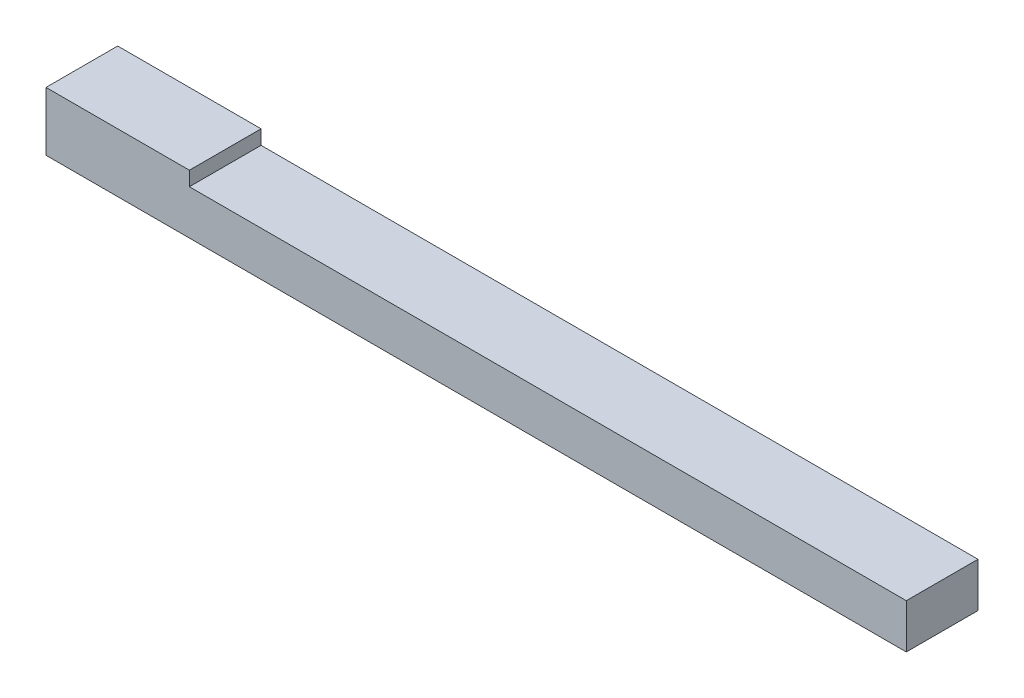
ISO-10303-21;
HEADER;
FILE_DESCRIPTION(('STEP AP214'),'2;1');
FILE_NAME('part.step','',(''),(''),'','','');
FILE_SCHEMA(('AUTOMOTIVE_DESIGN { 1 0 10303 214 1 1 1 1 }'));
ENDSEC;
DATA;
#1=APPLICATION_CONTEXT('core data for automotive mechanical design processes');
#2=APPLICATION_PROTOCOL_DEFINITION('international standard','automotive_design',2000,#1);
#3=PRODUCT_CONTEXT('',#1,'mechanical');
#4=PRODUCT('Part','Part','',(#3));
#5=PRODUCT_RELATED_PRODUCT_CATEGORY('part','',(#4));
#6=PRODUCT_DEFINITION_FORMATION('','',#4);
#7=PRODUCT_DEFINITION_CONTEXT('part definition',#1,'design');
#8=PRODUCT_DEFINITION('design','',#6,#7);
#9=PRODUCT_DEFINITION_SHAPE('','',#8);
#10=(LENGTH_UNIT() NAMED_UNIT(*) SI_UNIT(.MILLI.,.METRE.));
#11=(NAMED_UNIT(*) PLANE_ANGLE_UNIT() SI_UNIT($,.RADIAN.));
#12=(NAMED_UNIT(*) SI_UNIT($,.STERADIAN.) SOLID_ANGLE_UNIT());
#13=UNCERTAINTY_MEASURE_WITH_UNIT(LENGTH_MEASURE(1.E-05),#10,'distance_accuracy_value','');
#14=(GEOMETRIC_REPRESENTATION_CONTEXT(3) GLOBAL_UNCERTAINTY_ASSIGNED_CONTEXT((#13)) GLOBAL_UNIT_ASSIGNED_CONTEXT((#10,
#11,#12)) REPRESENTATION_CONTEXT('',''));
#15=CARTESIAN_POINT('',(0.,0.,0.));
#16=DIRECTION('',(0.,0.,1.));
#17=DIRECTION('',(1.,0.,0.));
#18=AXIS2_PLACEMENT_3D('',#15,#16,#17);
#19=CARTESIAN_POINT('',(0.,6.2,0.));
#20=DIRECTION('',(-1.,0.,0.));
#21=DIRECTION('',(0.,0.,1.));
#22=AXIS2_PLACEMENT_3D('',#19,#20,#21);
#23=PLANE('',#22);
#24=DIRECTION('',(0.,0.,-1.));
#25=VECTOR('',#24,1.);
#26=CARTESIAN_POINT('',(0.,0.,0.));
#27=LINE('',#26,#25);
#28=CARTESIAN_POINT('',(0.,0.,0.));
#29=VERTEX_POINT('',#28);
#30=CARTESIAN_POINT('',(0.,0.,-10.));
#31=VERTEX_POINT('',#30);
#32=EDGE_CURVE('E91',#29,#31,#27,.T.);
#33=ORIENTED_EDGE('',*,*,#32,.T.);
#34=DIRECTION('',(0.,-1.,0.));
#35=VECTOR('',#34,1.);
#36=CARTESIAN_POINT('',(0.,6.2,-10.));
#37=LINE('',#36,#35);
#38=CARTESIAN_POINT('',(0.,6.2,-10.));
#39=VERTEX_POINT('',#38);
#40=EDGE_CURVE('E11',#39,#31,#37,.T.);
#41=ORIENTED_EDGE('',*,*,#40,.F.);
#42=DIRECTION('',(0.,0.,-1.));
#43=VECTOR('',#42,1.);
#44=CARTESIAN_POINT('',(0.,6.2,0.));
#45=LINE('',#44,#43);
#46=CARTESIAN_POINT('',(0.,6.2,0.));
#47=VERTEX_POINT('',#46);
#48=EDGE_CURVE('E85',#47,#39,#45,.T.);
#49=ORIENTED_EDGE('',*,*,#48,.F.);
#50=DIRECTION('',(0.,-1.,0.));
#51=VECTOR('',#50,1.);
#52=CARTESIAN_POINT('',(0.,6.2,0.));
#53=LINE('',#52,#51);
#54=EDGE_CURVE('E77',#47,#29,#53,.T.);
#55=ORIENTED_EDGE('',*,*,#54,.T.);
#56=EDGE_LOOP('',(#33,#41,#49,#55));
#57=FACE_BOUND('',#56,.T.);
#58=ADVANCED_FACE('F35',(#57),#23,.F.);
#59=CARTESIAN_POINT('',(0.,6.2,-10.));
#60=DIRECTION('',(0.,0.,1.));
#61=DIRECTION('',(1.,0.,0.));
#62=AXIS2_PLACEMENT_3D('',#59,#60,#61);
#63=PLANE('',#62);
#64=DIRECTION('',(-1.,0.,0.));
#65=VECTOR('',#64,1.);
#66=CARTESIAN_POINT('',(0.,0.,-10.));
#67=LINE('',#66,#65);
#68=CARTESIAN_POINT('',(-120.,0.,-9.99999999999999));
#69=VERTEX_POINT('',#68);
#70=EDGE_CURVE('E94',#31,#69,#67,.T.);
#71=ORIENTED_EDGE('',*,*,#70,.T.);
#72=DIRECTION('',(0.,-1.,0.));
#73=VECTOR('',#72,1.);
#74=CARTESIAN_POINT('',(-120.,6.2,-9.99999999999999));
#75=LINE('',#74,#73);
#76=CARTESIAN_POINT('',(-120.,8.2,-9.99999999999999));
#77=VERTEX_POINT('',#76);
#78=EDGE_CURVE('E42',#77,#69,#75,.T.);
#79=ORIENTED_EDGE('',*,*,#78,.F.);
#80=DIRECTION('',(-1.,0.,0.));
#81=VECTOR('',#80,1.);
#82=CARTESIAN_POINT('',(-120.,8.2,-9.99999999999999));
#83=LINE('',#82,#81);
#84=CARTESIAN_POINT('',(-100.,8.2,-9.99999999999999));
#85=VERTEX_POINT('',#84);
#86=EDGE_CURVE('E118',#85,#77,#83,.T.);
#87=ORIENTED_EDGE('',*,*,#86,.F.);
#88=DIRECTION('',(0.,-1.,0.));
#89=VECTOR('',#88,1.);
#90=CARTESIAN_POINT('',(-100.,8.2,-9.99999999999999));
#91=LINE('',#90,#89);
#92=CARTESIAN_POINT('',(-100.,6.2,-9.99999999999999));
#93=VERTEX_POINT('',#92);
#94=EDGE_CURVE('E99',#85,#93,#91,.T.);
#95=ORIENTED_EDGE('',*,*,#94,.T.);
#96=DIRECTION('',(-1.,0.,0.));
#97=VECTOR('',#96,1.);
#98=CARTESIAN_POINT('',(0.,6.2,-10.));
#99=LINE('',#98,#97);
#100=EDGE_CURVE('E135',#39,#93,#99,.T.);
#101=ORIENTED_EDGE('',*,*,#100,.F.);
#102=ORIENTED_EDGE('',*,*,#40,.T.);
#103=EDGE_LOOP('',(#71,#79,#87,#95,#101,#102));
#104=FACE_BOUND('',#103,.T.);
#105=ADVANCED_FACE('F115',(#104),#63,.F.);
#106=CARTESIAN_POINT('',(-120.,6.2,0.));
#107=DIRECTION('',(1.,0.,0.));
#108=DIRECTION('',(0.,0.,-1.));
#109=AXIS2_PLACEMENT_3D('',#106,#107,#108);
#110=PLANE('',#109);
#111=DIRECTION('',(0.,0.,1.));
#112=VECTOR('',#111,1.);
#113=CARTESIAN_POINT('',(-120.,0.,0.));
#114=LINE('',#113,#112);
#115=CARTESIAN_POINT('',(-120.,0.,0.));
#116=VERTEX_POINT('',#115);
#117=EDGE_CURVE('E86',#69,#116,#114,.T.);
#118=ORIENTED_EDGE('',*,*,#117,.T.);
#119=DIRECTION('',(0.,-1.,0.));
#120=VECTOR('',#119,1.);
#121=CARTESIAN_POINT('',(-120.,6.2,0.));
#122=LINE('',#121,#120);
#123=CARTESIAN_POINT('',(-120.,8.2,0.));
#124=VERTEX_POINT('',#123);
#125=EDGE_CURVE('E81',#124,#116,#122,.T.);
#126=ORIENTED_EDGE('',*,*,#125,.F.);
#127=DIRECTION('',(0.,0.,1.));
#128=VECTOR('',#127,1.);
#129=CARTESIAN_POINT('',(-120.,8.2,-9.99999999999999));
#130=LINE('',#129,#128);
#131=EDGE_CURVE('E111',#77,#124,#130,.T.);
#132=ORIENTED_EDGE('',*,*,#131,.F.);
#133=ORIENTED_EDGE('',*,*,#78,.T.);
#134=EDGE_LOOP('',(#118,#126,#132,#133));
#135=FACE_BOUND('',#134,.T.);
#136=ADVANCED_FACE('F109',(#135),#110,.F.);
#137=CARTESIAN_POINT('',(0.,6.2,0.));
#138=DIRECTION('',(0.,0.,-1.));
#139=DIRECTION('',(-1.,0.,0.));
#140=AXIS2_PLACEMENT_3D('',#137,#138,#139);
#141=PLANE('',#140);
#142=DIRECTION('',(1.,0.,0.));
#143=VECTOR('',#142,1.);
#144=CARTESIAN_POINT('',(0.,0.,0.));
#145=LINE('',#144,#143);
#146=EDGE_CURVE('E74',#116,#29,#145,.T.);
#147=ORIENTED_EDGE('',*,*,#146,.T.);
#148=ORIENTED_EDGE('',*,*,#54,.F.);
#149=DIRECTION('',(1.,0.,0.));
#150=VECTOR('',#149,1.);
#151=CARTESIAN_POINT('',(0.,6.2,0.));
#152=LINE('',#151,#150);
#153=CARTESIAN_POINT('',(-100.,6.2,0.));
#154=VERTEX_POINT('',#153);
#155=EDGE_CURVE('E54',#154,#47,#152,.T.);
#156=ORIENTED_EDGE('',*,*,#155,.F.);
#157=DIRECTION('',(0.,-1.,0.));
#158=VECTOR('',#157,1.);
#159=CARTESIAN_POINT('',(-100.,8.2,0.));
#160=LINE('',#159,#158);
#161=CARTESIAN_POINT('',(-100.,8.2,0.));
#162=VERTEX_POINT('',#161);
#163=EDGE_CURVE('E95',#162,#154,#160,.T.);
#164=ORIENTED_EDGE('',*,*,#163,.F.);
#165=DIRECTION('',(1.,0.,0.));
#166=VECTOR('',#165,1.);
#167=CARTESIAN_POINT('',(-120.,8.2,0.));
#168=LINE('',#167,#166);
#169=EDGE_CURVE('E130',#124,#162,#168,.T.);
#170=ORIENTED_EDGE('',*,*,#169,.F.);
#171=ORIENTED_EDGE('',*,*,#125,.T.);
#172=EDGE_LOOP('',(#147,#148,#156,#164,#170,#171));
#173=FACE_BOUND('',#172,.T.);
#174=ADVANCED_FACE('F76',(#173),#141,.F.);
#175=CARTESIAN_POINT('',(0.,6.2,0.));
#176=DIRECTION('',(0.,1.,0.));
#177=DIRECTION('',(0.,0.,1.));
#178=AXIS2_PLACEMENT_3D('',#175,#176,#177);
#179=PLANE('',#178);
#180=DIRECTION('',(0.,0.,-1.));
#181=VECTOR('',#180,1.);
#182=CARTESIAN_POINT('',(-100.,6.2,-9.99999999999999));
#183=LINE('',#182,#181);
#184=EDGE_CURVE('E49',#154,#93,#183,.T.);
#185=ORIENTED_EDGE('',*,*,#184,.F.);
#186=ORIENTED_EDGE('',*,*,#155,.T.);
#187=ORIENTED_EDGE('',*,*,#48,.T.);
#188=ORIENTED_EDGE('',*,*,#100,.T.);
#189=EDGE_LOOP('',(#185,#186,#187,#188));
#190=FACE_BOUND('',#189,.T.);
#191=ADVANCED_FACE('F137',(#190),#179,.T.);
#192=CARTESIAN_POINT('',(0.,0.,0.));
#193=DIRECTION('',(0.,1.,0.));
#194=DIRECTION('',(0.,0.,1.));
#195=AXIS2_PLACEMENT_3D('',#192,#193,#194);
#196=PLANE('',#195);
#197=ORIENTED_EDGE('',*,*,#32,.F.);
#198=ORIENTED_EDGE('',*,*,#146,.F.);
#199=ORIENTED_EDGE('',*,*,#117,.F.);
#200=ORIENTED_EDGE('',*,*,#70,.F.);
#201=EDGE_LOOP('',(#197,#198,#199,#200));
#202=FACE_BOUND('',#201,.T.);
#203=ADVANCED_FACE('F93',(#202),#196,.F.);
#204=CARTESIAN_POINT('',(-100.,8.2,-9.99999999999999));
#205=DIRECTION('',(-1.,0.,0.));
#206=DIRECTION('',(0.,0.,1.));
#207=AXIS2_PLACEMENT_3D('',#204,#205,#206);
#208=PLANE('',#207);
#209=ORIENTED_EDGE('',*,*,#184,.T.);
#210=ORIENTED_EDGE('',*,*,#94,.F.);
#211=DIRECTION('',(0.,0.,-1.));
#212=VECTOR('',#211,1.);
#213=CARTESIAN_POINT('',(-100.,8.2,-9.99999999999999));
#214=LINE('',#213,#212);
#215=EDGE_CURVE('E126',#162,#85,#214,.T.);
#216=ORIENTED_EDGE('',*,*,#215,.F.);
#217=ORIENTED_EDGE('',*,*,#163,.T.);
#218=EDGE_LOOP('',(#209,#210,#216,#217));
#219=FACE_BOUND('',#218,.T.);
#220=ADVANCED_FACE('F139',(#219),#208,.F.);
#221=CARTESIAN_POINT('',(0.,8.2,0.));
#222=DIRECTION('',(0.,1.,0.));
#223=DIRECTION('',(0.,0.,1.));
#224=AXIS2_PLACEMENT_3D('',#221,#222,#223);
#225=PLANE('',#224);
#226=ORIENTED_EDGE('',*,*,#131,.T.);
#227=ORIENTED_EDGE('',*,*,#169,.T.);
#228=ORIENTED_EDGE('',*,*,#215,.T.);
#229=ORIENTED_EDGE('',*,*,#86,.T.);
#230=EDGE_LOOP('',(#226,#227,#228,#229));
#231=FACE_BOUND('',#230,.T.);
#232=ADVANCED_FACE('F122',(#231),#225,.T.);
#233=CLOSED_SHELL('',(#58,#105,#136,#174,#191,#203,#220,#232));
#234=MANIFOLD_SOLID_BREP('B2',#233);
#235=ADVANCED_BREP_SHAPE_REPRESENTATION('',(#18,#234),#14);
#236=SHAPE_DEFINITION_REPRESENTATION(#9,#235);
ENDSEC;
END-ISO-10303-21;
